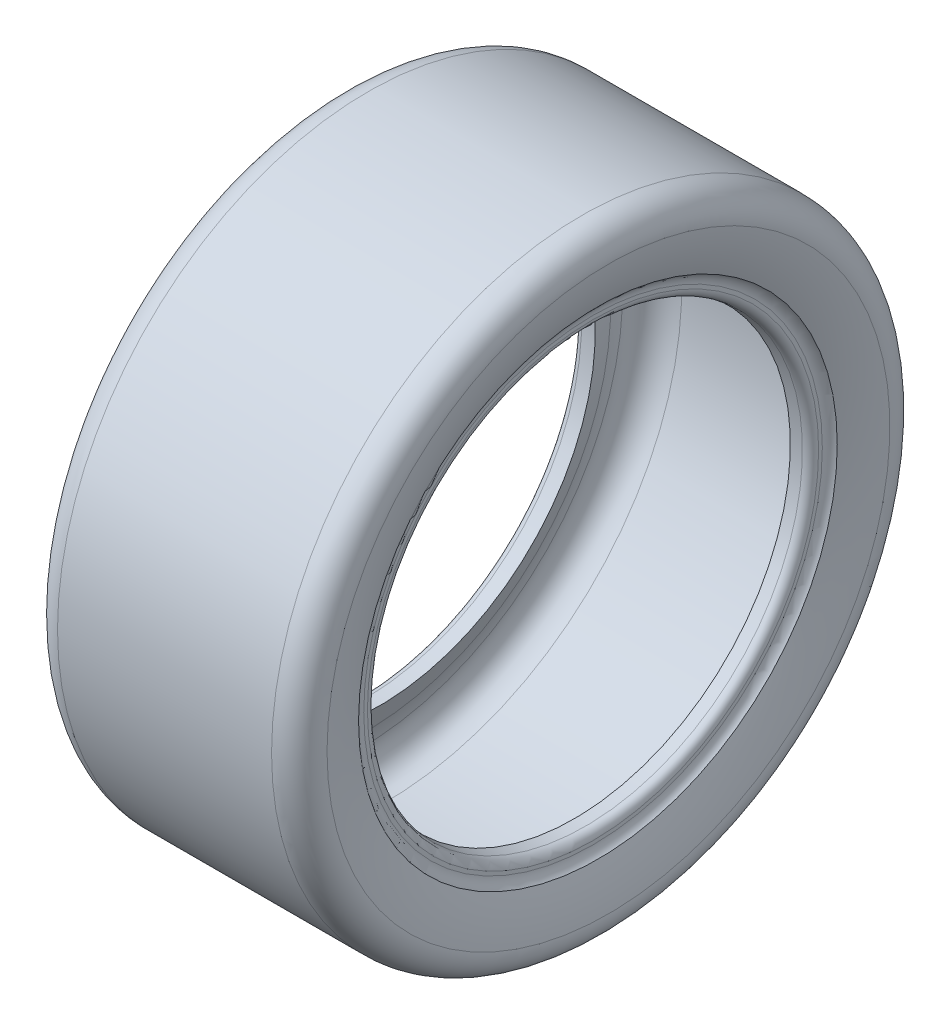
ISO-10303-21;
HEADER;
FILE_DESCRIPTION(('STEP AP214'),'2;1');
FILE_NAME('part.step','',(''),(''),'','','');
FILE_SCHEMA(('AUTOMOTIVE_DESIGN { 1 0 10303 214 1 1 1 1 }'));
ENDSEC;
DATA;
#1=APPLICATION_CONTEXT('core data for automotive mechanical design processes');
#2=APPLICATION_PROTOCOL_DEFINITION('international standard','automotive_design',2000,#1);
#3=PRODUCT_CONTEXT('',#1,'mechanical');
#4=PRODUCT('Part','Part','',(#3));
#5=PRODUCT_RELATED_PRODUCT_CATEGORY('part','',(#4));
#6=PRODUCT_DEFINITION_FORMATION('','',#4);
#7=PRODUCT_DEFINITION_CONTEXT('part definition',#1,'design');
#8=PRODUCT_DEFINITION('design','',#6,#7);
#9=PRODUCT_DEFINITION_SHAPE('','',#8);
#10=(LENGTH_UNIT() NAMED_UNIT(*) SI_UNIT(.MILLI.,.METRE.));
#11=(NAMED_UNIT(*) PLANE_ANGLE_UNIT() SI_UNIT($,.RADIAN.));
#12=(NAMED_UNIT(*) SI_UNIT($,.STERADIAN.) SOLID_ANGLE_UNIT());
#13=UNCERTAINTY_MEASURE_WITH_UNIT(LENGTH_MEASURE(1.E-05),#10,'distance_accuracy_value','');
#14=(GEOMETRIC_REPRESENTATION_CONTEXT(3) GLOBAL_UNCERTAINTY_ASSIGNED_CONTEXT((#13)) GLOBAL_UNIT_ASSIGNED_CONTEXT((#10,
#11,#12)) REPRESENTATION_CONTEXT('',''));
#15=CARTESIAN_POINT('',(0.,0.,0.));
#16=DIRECTION('',(0.,0.,1.));
#17=DIRECTION('',(1.,0.,0.));
#18=AXIS2_PLACEMENT_3D('',#15,#16,#17);
#19=CARTESIAN_POINT('',(99.3419712141864,0.,0.));
#20=DIRECTION('',(-1.,0.,0.));
#21=DIRECTION('',(0.,0.,1.));
#22=AXIS2_PLACEMENT_3D('',#19,#20,#21);
#23=TOROIDAL_SURFACE('',#22,205.,20.);
#24=CARTESIAN_POINT('',(99.3419712141864,0.,0.));
#25=DIRECTION('',(-1.,0.,0.));
#26=DIRECTION('',(0.,0.,1.));
#27=AXIS2_PLACEMENT_3D('',#24,#25,#26);
#28=CIRCLE('',#27,225.);
#29=CARTESIAN_POINT('',(99.3419712141864,0.,225.));
#30=VERTEX_POINT('',#29);
#31=EDGE_CURVE('E103',#30,#30,#28,.T.);
#32=ORIENTED_EDGE('',*,*,#31,.T.);
#33=EDGE_LOOP('',(#32));
#34=FACE_BOUND('',#33,.T.);
#35=CARTESIAN_POINT('',(118.796544816493,0.,0.));
#36=DIRECTION('',(-1.,0.,0.));
#37=DIRECTION('',(0.,0.,1.));
#38=AXIS2_PLACEMENT_3D('',#35,#36,#37);
#39=CIRCLE('',#38,200.361081381137);
#40=CARTESIAN_POINT('',(118.796544816493,0.,200.361081381137));
#41=VERTEX_POINT('',#40);
#42=EDGE_CURVE('E10',#41,#41,#39,.T.);
#43=ORIENTED_EDGE('',*,*,#42,.F.);
#44=EDGE_LOOP('',(#43));
#45=FACE_BOUND('',#44,.T.);
#46=ADVANCED_FACE('F33',(#34,#45),#23,.F.);
#47=CARTESIAN_POINT('',(15.2344827694,0.,0.));
#48=DIRECTION('',(-1.,0.,0.));
#49=DIRECTION('',(0.,0.,1.));
#50=AXIS2_PLACEMENT_3D('',#47,#48,#49);
#51=TOROIDAL_SURFACE('',#50,225.055324887,106.465517223995);
#52=ORIENTED_EDGE('',*,*,#42,.T.);
#53=EDGE_LOOP('',(#52));
#54=FACE_BOUND('',#53,.T.);
#55=CARTESIAN_POINT('',(113.819998649395,0.,0.));
#56=DIRECTION('',(-1.,0.,0.));
#57=DIRECTION('',(0.,0.,1.));
#58=AXIS2_PLACEMENT_3D('',#55,#56,#57);
#59=CIRCLE('',#58,184.85828001492);
#60=CARTESIAN_POINT('',(113.819998649395,0.,184.85828001492));
#61=VERTEX_POINT('',#60);
#62=EDGE_CURVE('E39',#61,#61,#59,.T.);
#63=ORIENTED_EDGE('',*,*,#62,.F.);
#64=EDGE_LOOP('',(#63));
#65=FACE_BOUND('',#64,.T.);
#66=ADVANCED_FACE('F163',(#54,#65),#51,.F.);
#67=CARTESIAN_POINT('',(105.143092091396,0.,0.));
#68=DIRECTION('',(1.,0.,0.));
#69=DIRECTION('',(0.,0.,-1.));
#70=AXIS2_PLACEMENT_3D('',#67,#68,#69);
#71=CONICAL_SURFACE('',#70,163.577678120301,1.18363725096993);
#72=ORIENTED_EDGE('',*,*,#62,.T.);
#73=EDGE_LOOP('',(#72));
#74=FACE_BOUND('',#73,.T.);
#75=CARTESIAN_POINT('',(105.143092091396,0.,0.));
#76=DIRECTION('',(-1.,0.,0.));
#77=DIRECTION('',(0.,0.,1.));
#78=AXIS2_PLACEMENT_3D('',#75,#76,#77);
#79=CIRCLE('',#78,163.577678120301);
#80=CARTESIAN_POINT('',(105.143092091396,0.,163.577678120301));
#81=VERTEX_POINT('',#80);
#82=EDGE_CURVE('E43',#81,#81,#79,.T.);
#83=ORIENTED_EDGE('',*,*,#82,.F.);
#84=EDGE_LOOP('',(#83));
#85=FACE_BOUND('',#84,.T.);
#86=ADVANCED_FACE('F160',(#74,#85),#71,.T.);
#87=CARTESIAN_POINT('',(113.557808205174,0.,0.));
#88=DIRECTION('',(1.,0.,0.));
#89=DIRECTION('',(0.,0.,-1.));
#90=AXIS2_PLACEMENT_3D('',#87,#88,#89);
#91=CONICAL_SURFACE('',#90,164.313870386929,0.0872664625860052);
#92=ORIENTED_EDGE('',*,*,#82,.T.);
#93=EDGE_LOOP('',(#92));
#94=FACE_BOUND('',#93,.T.);
#95=CARTESIAN_POINT('',(113.557808205174,0.,0.));
#96=DIRECTION('',(-1.,0.,0.));
#97=DIRECTION('',(0.,0.,1.));
#98=AXIS2_PLACEMENT_3D('',#95,#96,#97);
#99=CIRCLE('',#98,164.313870386929);
#100=CARTESIAN_POINT('',(113.557808205174,0.,164.313870386929));
#101=VERTEX_POINT('',#100);
#102=EDGE_CURVE('E47',#101,#101,#99,.T.);
#103=ORIENTED_EDGE('',*,*,#102,.F.);
#104=EDGE_LOOP('',(#103));
#105=FACE_BOUND('',#104,.T.);
#106=ADVANCED_FACE('F156',(#94,#105),#91,.F.);
#107=CARTESIAN_POINT('',(113.00001144334,0.,0.));
#108=DIRECTION('',(-1.,0.,0.));
#109=DIRECTION('',(0.,0.,1.));
#110=AXIS2_PLACEMENT_3D('',#107,#108,#109);
#111=TOROIDAL_SURFACE('',#110,170.689516550019,6.40000009565922);
#112=ORIENTED_EDGE('',*,*,#102,.T.);
#113=EDGE_LOOP('',(#112));
#114=FACE_BOUND('',#113,.T.);
#115=CARTESIAN_POINT('',(119.400011538999,0.,0.));
#116=DIRECTION('',(-1.,0.,0.));
#117=DIRECTION('',(0.,0.,1.));
#118=AXIS2_PLACEMENT_3D('',#115,#116,#117);
#119=CIRCLE('',#118,170.689516550019);
#120=CARTESIAN_POINT('',(119.400011538999,0.,170.689516550019));
#121=VERTEX_POINT('',#120);
#122=EDGE_CURVE('E52',#121,#121,#119,.T.);
#123=ORIENTED_EDGE('',*,*,#122,.F.);
#124=EDGE_LOOP('',(#123));
#125=FACE_BOUND('',#124,.T.);
#126=ADVANCED_FACE('F152',(#114,#125),#111,.T.);
#127=CARTESIAN_POINT('',(119.4000115395,173.476920439,0.));
#128=DIRECTION('',(1.,0.,0.));
#129=DIRECTION('',(0.,0.,-1.));
#130=AXIS2_PLACEMENT_3D('',#127,#128,#129);
#131=PLANE('',#130);
#132=ORIENTED_EDGE('',*,*,#122,.T.);
#133=EDGE_LOOP('',(#132));
#134=FACE_BOUND('',#133,.T.);
#135=CARTESIAN_POINT('',(119.40001154,0.,0.));
#136=DIRECTION('',(-1.,0.,0.));
#137=DIRECTION('',(0.,0.,1.));
#138=AXIS2_PLACEMENT_3D('',#135,#136,#137);
#139=CIRCLE('',#138,173.476920439);
#140=CARTESIAN_POINT('',(119.40001154,0.,173.476920439));
#141=VERTEX_POINT('',#140);
#142=EDGE_CURVE('E55',#141,#141,#139,.T.);
#143=ORIENTED_EDGE('',*,*,#142,.F.);
#144=EDGE_LOOP('',(#143));
#145=FACE_BOUND('',#144,.T.);
#146=ADVANCED_FACE('F148',(#134,#145),#131,.T.);
#147=CARTESIAN_POINT('',(129.100011349,0.,0.));
#148=DIRECTION('',(-1.,0.,0.));
#149=DIRECTION('',(0.,0.,1.));
#150=AXIS2_PLACEMENT_3D('',#147,#148,#149);
#151=TOROIDAL_SURFACE('',#150,173.476920439,9.69999980899999);
#152=ORIENTED_EDGE('',*,*,#142,.T.);
#153=EDGE_LOOP('',(#152));
#154=FACE_BOUND('',#153,.T.);
#155=CARTESIAN_POINT('',(123.079852774856,0.,0.));
#156=DIRECTION('',(-1.,0.,0.));
#157=DIRECTION('',(0.,0.,1.));
#158=AXIS2_PLACEMENT_3D('',#155,#156,#157);
#159=CIRCLE('',#158,181.082687135182);
#160=CARTESIAN_POINT('',(123.079852774856,0.,181.082687135182));
#161=VERTEX_POINT('',#160);
#162=EDGE_CURVE('E58',#161,#161,#159,.T.);
#163=ORIENTED_EDGE('',*,*,#162,.F.);
#164=EDGE_LOOP('',(#163));
#165=FACE_BOUND('',#164,.T.);
#166=ADVANCED_FACE('F144',(#154,#165),#151,.F.);
#167=CARTESIAN_POINT('',(15.2344827694,0.,0.));
#168=DIRECTION('',(-1.,0.,0.));
#169=DIRECTION('',(0.,0.,1.));
#170=AXIS2_PLACEMENT_3D('',#167,#168,#169);
#171=TOROIDAL_SURFACE('',#170,225.055324887,116.465517224912);
#172=ORIENTED_EDGE('',*,*,#162,.T.);
#173=EDGE_LOOP('',(#172));
#174=FACE_BOUND('',#173,.T.);
#175=CARTESIAN_POINT('',(131.065546312431,0.,0.));
#176=DIRECTION('',(-1.,0.,0.));
#177=DIRECTION('',(0.,0.,1.));
#178=AXIS2_PLACEMENT_3D('',#175,#176,#177);
#179=CIRCLE('',#178,212.915249889024);
#180=CARTESIAN_POINT('',(131.065546312431,0.,212.915249889024));
#181=VERTEX_POINT('',#180);
#182=EDGE_CURVE('E61',#181,#181,#179,.T.);
#183=ORIENTED_EDGE('',*,*,#182,.F.);
#184=EDGE_LOOP('',(#183));
#185=FACE_BOUND('',#184,.T.);
#186=ADVANCED_FACE('F140',(#174,#185),#171,.T.);
#187=CARTESIAN_POINT('',(111.174497647899,0.,0.));
#188=DIRECTION('',(-1.,0.,0.));
#189=DIRECTION('',(0.,0.,1.));
#190=AXIS2_PLACEMENT_3D('',#187,#188,#189);
#191=TOROIDAL_SURFACE('',#190,215.,20.);
#192=ORIENTED_EDGE('',*,*,#182,.T.);
#193=EDGE_LOOP('',(#192));
#194=FACE_BOUND('',#193,.T.);
#195=CARTESIAN_POINT('',(111.174497647899,0.,0.));
#196=DIRECTION('',(-1.,0.,0.));
#197=DIRECTION('',(0.,0.,1.));
#198=AXIS2_PLACEMENT_3D('',#195,#196,#197);
#199=CIRCLE('',#198,235.);
#200=CARTESIAN_POINT('',(111.174497647899,0.,235.));
#201=VERTEX_POINT('',#200);
#202=EDGE_CURVE('E64',#201,#201,#199,.T.);
#203=ORIENTED_EDGE('',*,*,#202,.F.);
#204=EDGE_LOOP('',(#203));
#205=FACE_BOUND('',#204,.T.);
#206=ADVANCED_FACE('F136',(#194,#205),#191,.T.);
#207=CARTESIAN_POINT('',(131.174497647899,0.,0.));
#208=DIRECTION('',(-1.,0.,0.));
#209=DIRECTION('',(0.,0.,1.));
#210=AXIS2_PLACEMENT_3D('',#207,#208,#209);
#211=CYLINDRICAL_SURFACE('',#210,235.);
#212=ORIENTED_EDGE('',*,*,#202,.T.);
#213=EDGE_LOOP('',(#212));
#214=FACE_BOUND('',#213,.T.);
#215=CARTESIAN_POINT('',(-50.745233070362,0.,0.));
#216=DIRECTION('',(-1.,0.,0.));
#217=DIRECTION('',(0.,0.,1.));
#218=AXIS2_PLACEMENT_3D('',#215,#216,#217);
#219=CIRCLE('',#218,235.);
#220=CARTESIAN_POINT('',(-50.745233070362,0.,235.));
#221=VERTEX_POINT('',#220);
#222=EDGE_CURVE('E67',#221,#221,#219,.T.);
#223=ORIENTED_EDGE('',*,*,#222,.F.);
#224=EDGE_LOOP('',(#223));
#225=FACE_BOUND('',#224,.T.);
#226=ADVANCED_FACE('F132',(#214,#225),#211,.T.);
#227=CARTESIAN_POINT('',(-50.745233070362,0.,0.));
#228=DIRECTION('',(-1.,0.,0.));
#229=DIRECTION('',(0.,0.,1.));
#230=AXIS2_PLACEMENT_3D('',#227,#228,#229);
#231=TOROIDAL_SURFACE('',#230,215.,20.);
#232=ORIENTED_EDGE('',*,*,#222,.T.);
#233=EDGE_LOOP('',(#232));
#234=FACE_BOUND('',#233,.T.);
#235=CARTESIAN_POINT('',(-70.5748254663708,0.,0.));
#236=DIRECTION('',(-1.,0.,0.));
#237=DIRECTION('',(0.,0.,1.));
#238=AXIS2_PLACEMENT_3D('',#235,#236,#237);
#239=CIRCLE('',#238,212.3947619287);
#240=CARTESIAN_POINT('',(-70.5748254663708,0.,212.3947619287));
#241=VERTEX_POINT('',#240);
#242=EDGE_CURVE('E70',#241,#241,#239,.T.);
#243=ORIENTED_EDGE('',*,*,#242,.F.);
#244=EDGE_LOOP('',(#243));
#245=FACE_BOUND('',#244,.T.);
#246=ADVANCED_FACE('F128',(#234,#245),#231,.T.);
#247=CARTESIAN_POINT('',(37.0837156091,0.,0.));
#248=DIRECTION('',(-1.,0.,0.));
#249=DIRECTION('',(0.,0.,1.));
#250=AXIS2_PLACEMENT_3D('',#247,#248,#249);
#251=TOROIDAL_SURFACE('',#250,226.539083421,108.583715616);
#252=ORIENTED_EDGE('',*,*,#242,.T.);
#253=EDGE_LOOP('',(#252));
#254=FACE_BOUND('',#253,.T.);
#255=CARTESIAN_POINT('',(-61.42101154,0.,0.));
#256=DIRECTION('',(-1.,0.,0.));
#257=DIRECTION('',(0.,0.,1.));
#258=AXIS2_PLACEMENT_3D('',#255,#256,#257);
#259=CIRCLE('',#258,180.852739441013);
#260=CARTESIAN_POINT('',(-61.42101154,0.,180.852739441013));
#261=VERTEX_POINT('',#260);
#262=EDGE_CURVE('E73',#261,#261,#259,.T.);
#263=ORIENTED_EDGE('',*,*,#262,.F.);
#264=EDGE_LOOP('',(#263));
#265=FACE_BOUND('',#264,.T.);
#266=ADVANCED_FACE('F123',(#254,#265),#251,.T.);
#267=CARTESIAN_POINT('',(-59.61701154,176.966405789436,0.));
#268=CARTESIAN_POINT('',(-59.9166699974082,177.734480246837,0.));
#269=CARTESIAN_POINT('',(-60.5414970086895,179.755797868527,0.));
#270=CARTESIAN_POINT('',(-61.42101154,180.852739441013,0.));
#271=B_SPLINE_CURVE_WITH_KNOTS('',3,(#267,#268,#269,#270),.UNSPECIFIED.,.F.,.F.,(4,4),(0.,1.),.UNSPECIFIED.);
#272=CARTESIAN_POINT('',(131.174497647899,0.,0.));
#273=DIRECTION('',(-1.,0.,0.));
#274=AXIS1_PLACEMENT('',#272,#273);
#275=SURFACE_OF_REVOLUTION('',#271,#274);
#276=ORIENTED_EDGE('',*,*,#262,.T.);
#277=EDGE_LOOP('',(#276));
#278=FACE_BOUND('',#277,.T.);
#279=CARTESIAN_POINT('',(-59.61701154,0.,0.));
#280=DIRECTION('',(-1.,0.,0.));
#281=DIRECTION('',(0.,0.,1.));
#282=AXIS2_PLACEMENT_3D('',#279,#280,#281);
#283=CIRCLE('',#282,176.966405789436);
#284=CARTESIAN_POINT('',(-59.61701154,0.,176.966405789436));
#285=VERTEX_POINT('',#284);
#286=EDGE_CURVE('E76',#285,#285,#283,.T.);
#287=ORIENTED_EDGE('',*,*,#286,.F.);
#288=EDGE_LOOP('',(#287));
#289=FACE_BOUND('',#288,.T.);
#290=ADVANCED_FACE('F118',(#278,#289),#275,.F.);
#291=CARTESIAN_POINT('',(-59.4146173958158,0.,0.));
#292=DIRECTION('',(-1.,0.,0.));
#293=DIRECTION('',(0.,0.,1.));
#294=AXIS2_PLACEMENT_3D('',#291,#292,#293);
#295=CONICAL_SURFACE('',#294,175.458242785545,1.43739422986615);
#296=ORIENTED_EDGE('',*,*,#286,.T.);
#297=EDGE_LOOP('',(#296));
#298=FACE_BOUND('',#297,.T.);
#299=CARTESIAN_POINT('',(-59.4146173958158,0.,0.));
#300=DIRECTION('',(-1.,0.,0.));
#301=DIRECTION('',(0.,0.,1.));
#302=AXIS2_PLACEMENT_3D('',#299,#300,#301);
#303=CIRCLE('',#302,175.458242785545);
#304=CARTESIAN_POINT('',(-59.4146173958158,0.,175.458242785545));
#305=VERTEX_POINT('',#304);
#306=EDGE_CURVE('E79',#305,#305,#303,.T.);
#307=ORIENTED_EDGE('',*,*,#306,.F.);
#308=EDGE_LOOP('',(#307));
#309=FACE_BOUND('',#308,.T.);
#310=ADVANCED_FACE('F122',(#298,#309),#295,.F.);
#311=CARTESIAN_POINT('',(-59.40001154,174.92613352473,0.));
#312=CARTESIAN_POINT('',(-59.4050214015317,175.107032475728,0.));
#313=CARTESIAN_POINT('',(-59.4098890327642,175.284384181299,0.));
#314=CARTESIAN_POINT('',(-59.4146173958158,175.458242785545,0.));
#315=B_SPLINE_CURVE_WITH_KNOTS('',3,(#311,#312,#313,#314),.UNSPECIFIED.,.F.,.F.,(4,4),(0.,1.),.UNSPECIFIED.);
#316=CARTESIAN_POINT('',(131.174497647899,0.,0.));
#317=DIRECTION('',(-1.,0.,0.));
#318=AXIS1_PLACEMENT('',#316,#317);
#319=SURFACE_OF_REVOLUTION('',#315,#318);
#320=ORIENTED_EDGE('',*,*,#306,.T.);
#321=EDGE_LOOP('',(#320));
#322=FACE_BOUND('',#321,.T.);
#323=CARTESIAN_POINT('',(-59.40001154,0.,0.));
#324=DIRECTION('',(-1.,0.,0.));
#325=DIRECTION('',(0.,0.,1.));
#326=AXIS2_PLACEMENT_3D('',#323,#324,#325);
#327=CIRCLE('',#326,174.92613352473);
#328=CARTESIAN_POINT('',(-59.40001154,0.,174.92613352473));
#329=VERTEX_POINT('',#328);
#330=EDGE_CURVE('E82',#329,#329,#327,.T.);
#331=ORIENTED_EDGE('',*,*,#330,.F.);
#332=EDGE_LOOP('',(#331));
#333=FACE_BOUND('',#332,.T.);
#334=ADVANCED_FACE('F210',(#322,#333),#319,.F.);
#335=CARTESIAN_POINT('',(-59.4000115396298,170.689516550019,0.));
#336=DIRECTION('',(-1.,0.,0.));
#337=DIRECTION('',(0.,0.,1.));
#338=AXIS2_PLACEMENT_3D('',#335,#336,#337);
#339=PLANE('',#338);
#340=ORIENTED_EDGE('',*,*,#330,.T.);
#341=EDGE_LOOP('',(#340));
#342=FACE_BOUND('',#341,.T.);
#343=CARTESIAN_POINT('',(-59.4000115392597,0.,0.));
#344=DIRECTION('',(-1.,0.,0.));
#345=DIRECTION('',(0.,0.,1.));
#346=AXIS2_PLACEMENT_3D('',#343,#344,#345);
#347=CIRCLE('',#346,170.689516550019);
#348=CARTESIAN_POINT('',(-59.4000115392597,0.,170.689516550019));
#349=VERTEX_POINT('',#348);
#350=EDGE_CURVE('E85',#349,#349,#347,.T.);
#351=ORIENTED_EDGE('',*,*,#350,.F.);
#352=EDGE_LOOP('',(#351));
#353=FACE_BOUND('',#352,.T.);
#354=ADVANCED_FACE('F207',(#342,#353),#339,.T.);
#355=CARTESIAN_POINT('',(-53.0000114442597,0.,0.));
#356=DIRECTION('',(-1.,0.,0.));
#357=DIRECTION('',(0.,0.,1.));
#358=AXIS2_PLACEMENT_3D('',#355,#356,#357);
#359=TOROIDAL_SURFACE('',#358,170.68951654988,6.40000009499999);
#360=ORIENTED_EDGE('',*,*,#350,.T.);
#361=EDGE_LOOP('',(#360));
#362=FACE_BOUND('',#361,.T.);
#363=CARTESIAN_POINT('',(-53.5578082061964,0.,0.));
#364=DIRECTION('',(-1.,0.,0.));
#365=DIRECTION('',(0.,0.,1.));
#366=AXIS2_PLACEMENT_3D('',#363,#364,#365);
#367=CIRCLE('',#366,164.31387038746);
#368=CARTESIAN_POINT('',(-53.5578082061964,0.,164.31387038746));
#369=VERTEX_POINT('',#368);
#370=EDGE_CURVE('E88',#369,#369,#367,.T.);
#371=ORIENTED_EDGE('',*,*,#370,.F.);
#372=EDGE_LOOP('',(#371));
#373=FACE_BOUND('',#372,.T.);
#374=ADVANCED_FACE('F197',(#362,#373),#359,.T.);
#375=CARTESIAN_POINT('',(-42.2755508669167,163.340466169992,0.));
#376=CARTESIAN_POINT('',(-46.0382352725889,163.64236016608,0.));
#377=CARTESIAN_POINT('',(-49.7974551813935,163.984882126892,0.));
#378=CARTESIAN_POINT('',(-53.5578082061964,164.31387038746,0.));
#379=B_SPLINE_CURVE_WITH_KNOTS('',3,(#375,#376,#377,#378),.UNSPECIFIED.,.F.,.F.,(4,4),(0.,1.),.UNSPECIFIED.);
#380=CARTESIAN_POINT('',(131.174497647899,0.,0.));
#381=DIRECTION('',(-1.,0.,0.));
#382=AXIS1_PLACEMENT('',#380,#381);
#383=SURFACE_OF_REVOLUTION('',#379,#382);
#384=ORIENTED_EDGE('',*,*,#370,.T.);
#385=EDGE_LOOP('',(#384));
#386=FACE_BOUND('',#385,.T.);
#387=CARTESIAN_POINT('',(-42.2755508669167,0.,0.));
#388=DIRECTION('',(-1.,0.,0.));
#389=DIRECTION('',(0.,0.,1.));
#390=AXIS2_PLACEMENT_3D('',#387,#388,#389);
#391=CIRCLE('',#390,163.340466169992);
#392=CARTESIAN_POINT('',(-42.2755508669167,0.,163.340466169992));
#393=VERTEX_POINT('',#392);
#394=EDGE_CURVE('E91',#393,#393,#391,.T.);
#395=ORIENTED_EDGE('',*,*,#394,.F.);
#396=EDGE_LOOP('',(#395));
#397=FACE_BOUND('',#396,.T.);
#398=ADVANCED_FACE('F193',(#386,#397),#383,.F.);
#399=CARTESIAN_POINT('',(-52.3490830733608,0.,0.));
#400=DIRECTION('',(-1.,0.,0.));
#401=DIRECTION('',(0.,0.,1.));
#402=AXIS2_PLACEMENT_3D('',#399,#400,#401);
#403=CONICAL_SURFACE('',#402,185.059889787579,1.13652335873016);
#404=ORIENTED_EDGE('',*,*,#394,.T.);
#405=EDGE_LOOP('',(#404));
#406=FACE_BOUND('',#405,.T.);
#407=CARTESIAN_POINT('',(-52.3490830733608,0.,0.));
#408=DIRECTION('',(-1.,0.,0.));
#409=DIRECTION('',(0.,0.,1.));
#410=AXIS2_PLACEMENT_3D('',#407,#408,#409);
#411=CIRCLE('',#410,185.059889787579);
#412=CARTESIAN_POINT('',(-52.3490830733608,0.,185.059889787579));
#413=VERTEX_POINT('',#412);
#414=EDGE_CURVE('E94',#413,#413,#411,.T.);
#415=ORIENTED_EDGE('',*,*,#414,.F.);
#416=EDGE_LOOP('',(#415));
#417=FACE_BOUND('',#416,.T.);
#418=ADVANCED_FACE('F189',(#406,#417),#403,.T.);
#419=CARTESIAN_POINT('',(37.0837156091,0.,0.));
#420=DIRECTION('',(-1.,0.,0.));
#421=DIRECTION('',(0.,0.,1.));
#422=AXIS2_PLACEMENT_3D('',#419,#420,#421);
#423=TOROIDAL_SURFACE('',#422,226.539083421,98.583715616);
#424=ORIENTED_EDGE('',*,*,#414,.T.);
#425=EDGE_LOOP('',(#424));
#426=FACE_BOUND('',#425,.T.);
#427=CARTESIAN_POINT('',(-57.7246165269039,0.,0.));
#428=DIRECTION('',(-1.,0.,0.));
#429=DIRECTION('',(0.,0.,1.));
#430=AXIS2_PLACEMENT_3D('',#427,#428,#429);
#431=CIRCLE('',#430,199.518181470001);
#432=CARTESIAN_POINT('',(-57.7246165269039,0.,199.518181470001));
#433=VERTEX_POINT('',#432);
#434=EDGE_CURVE('E97',#433,#433,#431,.T.);
#435=ORIENTED_EDGE('',*,*,#434,.F.);
#436=EDGE_LOOP('',(#435));
#437=FACE_BOUND('',#436,.T.);
#438=ADVANCED_FACE('F183',(#426,#437),#423,.F.);
#439=CARTESIAN_POINT('',(-38.4905408900517,0.,0.));
#440=DIRECTION('',(-1.,0.,0.));
#441=DIRECTION('',(0.,0.,1.));
#442=AXIS2_PLACEMENT_3D('',#439,#440,#441);
#443=TOROIDAL_SURFACE('',#442,205.,20.);
#444=ORIENTED_EDGE('',*,*,#434,.T.);
#445=EDGE_LOOP('',(#444));
#446=FACE_BOUND('',#445,.T.);
#447=CARTESIAN_POINT('',(-38.4905408900517,0.,0.));
#448=DIRECTION('',(-1.,0.,0.));
#449=DIRECTION('',(0.,0.,1.));
#450=AXIS2_PLACEMENT_3D('',#447,#448,#449);
#451=CIRCLE('',#450,225.);
#452=CARTESIAN_POINT('',(-38.4905408900517,0.,225.));
#453=VERTEX_POINT('',#452);
#454=EDGE_CURVE('E100',#453,#453,#451,.T.);
#455=ORIENTED_EDGE('',*,*,#454,.F.);
#456=EDGE_LOOP('',(#455));
#457=FACE_BOUND('',#456,.T.);
#458=ADVANCED_FACE('F177',(#446,#457),#443,.F.);
#459=CARTESIAN_POINT('',(131.174497647899,0.,0.));
#460=DIRECTION('',(-1.,0.,0.));
#461=DIRECTION('',(0.,0.,1.));
#462=AXIS2_PLACEMENT_3D('',#459,#460,#461);
#463=CYLINDRICAL_SURFACE('',#462,225.);
#464=ORIENTED_EDGE('',*,*,#454,.T.);
#465=EDGE_LOOP('',(#464));
#466=FACE_BOUND('',#465,.T.);
#467=ORIENTED_EDGE('',*,*,#31,.F.);
#468=EDGE_LOOP('',(#467));
#469=FACE_BOUND('',#468,.T.);
#470=ADVANCED_FACE('F175',(#466,#469),#463,.F.);
#471=CLOSED_SHELL('',(#46,#66,#86,#106,#126,#146,#166,#186,#206,#226,#246,#266,#290,#310,#334,
#354,#374,#398,#418,#438,#458,#470));
#472=MANIFOLD_SOLID_BREP('B2',#471);
#473=ADVANCED_BREP_SHAPE_REPRESENTATION('',(#18,#472),#14);
#474=SHAPE_DEFINITION_REPRESENTATION(#9,#473);
ENDSEC;
END-ISO-10303-21;
